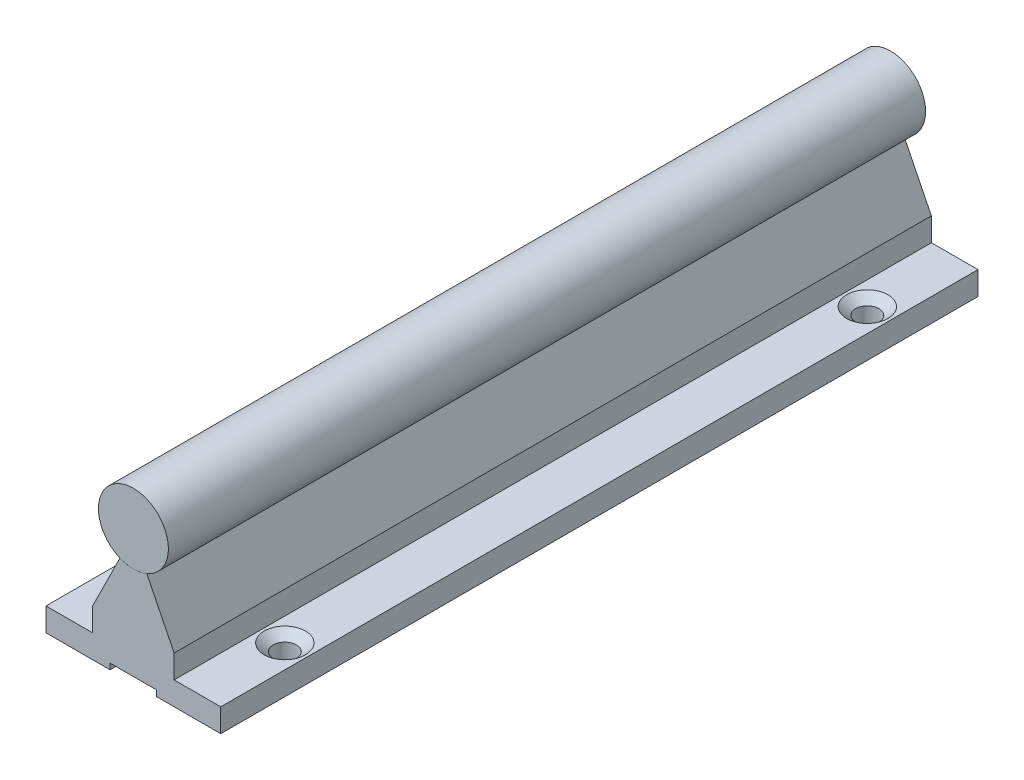
ISO-10303-21;
HEADER;
FILE_DESCRIPTION(('STEP AP214'),'2;1');
FILE_NAME('part.step','',(''),(''),'','','');
FILE_SCHEMA(('AUTOMOTIVE_DESIGN { 1 0 10303 214 1 1 1 1 }'));
ENDSEC;
DATA;
#1=APPLICATION_CONTEXT('core data for automotive mechanical design processes');
#2=APPLICATION_PROTOCOL_DEFINITION('international standard','automotive_design',2000,#1);
#3=PRODUCT_CONTEXT('',#1,'mechanical');
#4=PRODUCT('Part','Part','',(#3));
#5=PRODUCT_RELATED_PRODUCT_CATEGORY('part','',(#4));
#6=PRODUCT_DEFINITION_FORMATION('','',#4);
#7=PRODUCT_DEFINITION_CONTEXT('part definition',#1,'design');
#8=PRODUCT_DEFINITION('design','',#6,#7);
#9=PRODUCT_DEFINITION_SHAPE('','',#8);
#10=(LENGTH_UNIT() NAMED_UNIT(*) SI_UNIT(.MILLI.,.METRE.));
#11=(NAMED_UNIT(*) PLANE_ANGLE_UNIT() SI_UNIT($,.RADIAN.));
#12=(NAMED_UNIT(*) SI_UNIT($,.STERADIAN.) SOLID_ANGLE_UNIT());
#13=UNCERTAINTY_MEASURE_WITH_UNIT(LENGTH_MEASURE(1.E-05),#10,'distance_accuracy_value','');
#14=(GEOMETRIC_REPRESENTATION_CONTEXT(3) GLOBAL_UNCERTAINTY_ASSIGNED_CONTEXT((#13)) GLOBAL_UNIT_ASSIGNED_CONTEXT((#10,
#11,#12)) REPRESENTATION_CONTEXT('',''));
#15=CARTESIAN_POINT('',(0.,0.,0.));
#16=DIRECTION('',(0.,0.,1.));
#17=DIRECTION('',(1.,0.,0.));
#18=AXIS2_PLACEMENT_3D('',#15,#16,#17);
#19=CARTESIAN_POINT('',(0.,8.5,750.));
#20=DIRECTION('',(0.,0.,-1.));
#21=DIRECTION('',(-1.,0.,0.));
#22=AXIS2_PLACEMENT_3D('',#19,#20,#21);
#23=CYLINDRICAL_SURFACE('',#22,6.);
#24=CARTESIAN_POINT('',(0.,8.5,324.866250412161));
#25=DIRECTION('',(0.,0.,1.));
#26=DIRECTION('',(1.,0.,0.));
#27=AXIS2_PLACEMENT_3D('',#24,#25,#26);
#28=CIRCLE('',#27,6.);
#29=CARTESIAN_POINT('',(6.,8.5,324.866250412161));
#30=VERTEX_POINT('',#29);
#31=EDGE_CURVE('E11',#30,#30,#28,.T.);
#32=ORIENTED_EDGE('',*,*,#31,.T.);
#33=EDGE_LOOP('',(#32));
#34=FACE_BOUND('',#33,.T.);
#35=CARTESIAN_POINT('',(0.,8.5,454.866250412161));
#36=DIRECTION('',(0.,0.,-1.));
#37=DIRECTION('',(-1.,0.,0.));
#38=AXIS2_PLACEMENT_3D('',#35,#36,#37);
#39=CIRCLE('',#38,6.);
#40=CARTESIAN_POINT('',(-6.,8.5,454.866250412161));
#41=VERTEX_POINT('',#40);
#42=EDGE_CURVE('E61',#41,#41,#39,.T.);
#43=ORIENTED_EDGE('',*,*,#42,.T.);
#44=EDGE_LOOP('',(#43));
#45=FACE_BOUND('',#44,.T.);
#46=ADVANCED_FACE('F54',(#34,#45),#23,.T.);
#47=CARTESIAN_POINT('',(-15.,71.5,454.866250412161));
#48=DIRECTION('',(0.,0.,-1.));
#49=DIRECTION('',(-1.,0.,0.));
#50=AXIS2_PLACEMENT_3D('',#47,#48,#49);
#51=PLANE('',#50);
#52=ORIENTED_EDGE('',*,*,#42,.F.);
#53=EDGE_LOOP('',(#52));
#54=FACE_BOUND('',#53,.T.);
#55=ADVANCED_FACE('F67',(#54),#51,.F.);
#56=CARTESIAN_POINT('',(-15.,71.5,324.866250412161));
#57=DIRECTION('',(0.,0.,1.));
#58=DIRECTION('',(1.,0.,0.));
#59=AXIS2_PLACEMENT_3D('',#56,#57,#58);
#60=PLANE('',#59);
#61=ORIENTED_EDGE('',*,*,#31,.F.);
#62=EDGE_LOOP('',(#61));
#63=FACE_BOUND('',#62,.T.);
#64=ADVANCED_FACE('F66',(#63),#60,.F.);
#65=CLOSED_SHELL('',(#46,#55,#64));
#66=MANIFOLD_SOLID_BREP('B2',#65);
#67=CARTESIAN_POINT('',(-15.,-10.5,750.));
#68=DIRECTION('',(0.,-1.,0.));
#69=DIRECTION('',(0.,0.,-1.));
#70=AXIS2_PLACEMENT_3D('',#67,#68,#69);
#71=PLANE('',#70);
#72=CARTESIAN_POINT('',(-11.000000000001,-10.5,439.866250412161));
#73=DIRECTION('',(0.,1.,0.));
#74=DIRECTION('',(0.,0.,1.));
#75=AXIS2_PLACEMENT_3D('',#72,#73,#74);
#76=CIRCLE('',#75,3.5433);
#77=CARTESIAN_POINT('',(-11.000000000001,-10.5,443.409550412161));
#78=VERTEX_POINT('',#77);
#79=EDGE_CURVE('E264',#78,#78,#76,.T.);
#80=ORIENTED_EDGE('',*,*,#79,.F.);
#81=EDGE_LOOP('',(#80));
#82=FACE_BOUND('',#81,.T.);
#83=CARTESIAN_POINT('',(-11.0000000000014,-10.5,339.866250412161));
#84=DIRECTION('',(0.,1.,0.));
#85=DIRECTION('',(0.,0.,1.));
#86=AXIS2_PLACEMENT_3D('',#83,#84,#85);
#87=CIRCLE('',#86,3.5433);
#88=CARTESIAN_POINT('',(-11.0000000000014,-10.5,343.409550412161));
#89=VERTEX_POINT('',#88);
#90=EDGE_CURVE('E282',#89,#89,#87,.T.);
#91=ORIENTED_EDGE('',*,*,#90,.F.);
#92=EDGE_LOOP('',(#91));
#93=FACE_BOUND('',#92,.T.);
#94=DIRECTION('',(0.,0.,-1.));
#95=VECTOR('',#94,1.);
#96=CARTESIAN_POINT('',(-7.,-10.5,750.));
#97=LINE('',#96,#95);
#98=CARTESIAN_POINT('',(-7.,-10.5,454.866250412161));
#99=VERTEX_POINT('',#98);
#100=CARTESIAN_POINT('',(-7.,-10.5,324.866250412161));
#101=VERTEX_POINT('',#100);
#102=EDGE_CURVE('E227',#99,#101,#97,.T.);
#103=ORIENTED_EDGE('',*,*,#102,.T.);
#104=DIRECTION('',(-1.,0.,0.));
#105=VECTOR('',#104,1.);
#106=CARTESIAN_POINT('',(-15.,-10.5,324.866250412161));
#107=LINE('',#106,#105);
#108=CARTESIAN_POINT('',(-15.,-10.5,324.866250412161));
#109=VERTEX_POINT('',#108);
#110=EDGE_CURVE('E263',#101,#109,#107,.T.);
#111=ORIENTED_EDGE('',*,*,#110,.T.);
#112=DIRECTION('',(0.,0.,-1.));
#113=VECTOR('',#112,1.);
#114=CARTESIAN_POINT('',(-15.,-10.5,750.));
#115=LINE('',#114,#113);
#116=CARTESIAN_POINT('',(-15.,-10.5,454.866250412161));
#117=VERTEX_POINT('',#116);
#118=EDGE_CURVE('E222',#117,#109,#115,.T.);
#119=ORIENTED_EDGE('',*,*,#118,.F.);
#120=DIRECTION('',(1.,0.,0.));
#121=VECTOR('',#120,1.);
#122=CARTESIAN_POINT('',(-15.,-10.5,454.866250412161));
#123=LINE('',#122,#121);
#124=EDGE_CURVE('E357',#117,#99,#123,.T.);
#125=ORIENTED_EDGE('',*,*,#124,.T.);
#126=EDGE_LOOP('',(#103,#111,#119,#125));
#127=FACE_BOUND('',#126,.T.);
#128=ADVANCED_FACE('F99',(#82,#93,#127),#71,.F.);
#129=CARTESIAN_POINT('',(15.,-10.5,750.));
#130=DIRECTION('',(-1.,0.,0.));
#131=DIRECTION('',(0.,0.,1.));
#132=AXIS2_PLACEMENT_3D('',#129,#130,#131);
#133=PLANE('',#132);
#134=DIRECTION('',(0.,0.,-1.));
#135=VECTOR('',#134,1.);
#136=CARTESIAN_POINT('',(15.,-14.5,750.));
#137=LINE('',#136,#135);
#138=CARTESIAN_POINT('',(15.,-14.5,454.866250412161));
#139=VERTEX_POINT('',#138);
#140=CARTESIAN_POINT('',(15.,-14.5,324.866250412161));
#141=VERTEX_POINT('',#140);
#142=EDGE_CURVE('E293',#139,#141,#137,.T.);
#143=ORIENTED_EDGE('',*,*,#142,.T.);
#144=DIRECTION('',(0.,-1.,0.));
#145=VECTOR('',#144,1.);
#146=CARTESIAN_POINT('',(15.,71.5,324.866250412161));
#147=LINE('',#146,#145);
#148=CARTESIAN_POINT('',(15.,-10.5,324.866250412161));
#149=VERTEX_POINT('',#148);
#150=EDGE_CURVE('E125',#149,#141,#147,.T.);
#151=ORIENTED_EDGE('',*,*,#150,.F.);
#152=DIRECTION('',(0.,0.,-1.));
#153=VECTOR('',#152,1.);
#154=CARTESIAN_POINT('',(15.,-10.5,750.));
#155=LINE('',#154,#153);
#156=CARTESIAN_POINT('',(15.,-10.5,454.866250412161));
#157=VERTEX_POINT('',#156);
#158=EDGE_CURVE('E52',#157,#149,#155,.T.);
#159=ORIENTED_EDGE('',*,*,#158,.F.);
#160=DIRECTION('',(0.,-1.,0.));
#161=VECTOR('',#160,1.);
#162=CARTESIAN_POINT('',(15.,71.5,454.866250412161));
#163=LINE('',#162,#161);
#164=EDGE_CURVE('E371',#157,#139,#163,.T.);
#165=ORIENTED_EDGE('',*,*,#164,.T.);
#166=EDGE_LOOP('',(#143,#151,#159,#165));
#167=FACE_BOUND('',#166,.T.);
#168=ADVANCED_FACE('F105',(#167),#133,.F.);
#169=CARTESIAN_POINT('',(7.,-10.5,750.));
#170=DIRECTION('',(0.,-1.,0.));
#171=DIRECTION('',(0.,0.,-1.));
#172=AXIS2_PLACEMENT_3D('',#169,#170,#171);
#173=PLANE('',#172);
#174=CARTESIAN_POINT('',(10.999999999999,-10.5,439.866250412161));
#175=DIRECTION('',(0.,1.,0.));
#176=DIRECTION('',(0.,0.,1.));
#177=AXIS2_PLACEMENT_3D('',#174,#175,#176);
#178=CIRCLE('',#177,3.5433);
#179=CARTESIAN_POINT('',(10.999999999999,-10.5,443.409550412161));
#180=VERTEX_POINT('',#179);
#181=EDGE_CURVE('E277',#180,#180,#178,.T.);
#182=ORIENTED_EDGE('',*,*,#181,.F.);
#183=EDGE_LOOP('',(#182));
#184=FACE_BOUND('',#183,.T.);
#185=CARTESIAN_POINT('',(10.9999999999986,-10.5,339.866250412161));
#186=DIRECTION('',(0.,1.,0.));
#187=DIRECTION('',(0.,0.,1.));
#188=AXIS2_PLACEMENT_3D('',#185,#186,#187);
#189=CIRCLE('',#188,3.5433);
#190=CARTESIAN_POINT('',(10.9999999999986,-10.5,343.409550412161));
#191=VERTEX_POINT('',#190);
#192=EDGE_CURVE('E285',#191,#191,#189,.T.);
#193=ORIENTED_EDGE('',*,*,#192,.F.);
#194=EDGE_LOOP('',(#193));
#195=FACE_BOUND('',#194,.T.);
#196=ORIENTED_EDGE('',*,*,#158,.T.);
#197=DIRECTION('',(-1.,0.,0.));
#198=VECTOR('',#197,1.);
#199=CARTESIAN_POINT('',(7.,-10.5,324.866250412161));
#200=LINE('',#199,#198);
#201=CARTESIAN_POINT('',(7.,-10.5,324.866250412161));
#202=VERTEX_POINT('',#201);
#203=EDGE_CURVE('E265',#149,#202,#200,.T.);
#204=ORIENTED_EDGE('',*,*,#203,.T.);
#205=DIRECTION('',(0.,0.,-1.));
#206=VECTOR('',#205,1.);
#207=CARTESIAN_POINT('',(7.,-10.5,750.));
#208=LINE('',#207,#206);
#209=CARTESIAN_POINT('',(7.,-10.5,454.866250412161));
#210=VERTEX_POINT('',#209);
#211=EDGE_CURVE('E108',#210,#202,#208,.T.);
#212=ORIENTED_EDGE('',*,*,#211,.F.);
#213=DIRECTION('',(1.,0.,0.));
#214=VECTOR('',#213,1.);
#215=CARTESIAN_POINT('',(7.,-10.5,454.866250412161));
#216=LINE('',#215,#214);
#217=EDGE_CURVE('E257',#210,#157,#216,.T.);
#218=ORIENTED_EDGE('',*,*,#217,.T.);
#219=EDGE_LOOP('',(#196,#204,#212,#218));
#220=FACE_BOUND('',#219,.T.);
#221=ADVANCED_FACE('F259',(#184,#195,#220),#173,.F.);
#222=CARTESIAN_POINT('',(7.,-10.5,750.));
#223=DIRECTION('',(-1.,0.,0.));
#224=DIRECTION('',(0.,-1.,0.));
#225=AXIS2_PLACEMENT_3D('',#222,#223,#224);
#226=PLANE('',#225);
#227=ORIENTED_EDGE('',*,*,#211,.T.);
#228=DIRECTION('',(0.,1.,0.));
#229=VECTOR('',#228,1.);
#230=CARTESIAN_POINT('',(7.,-10.5,324.866250412161));
#231=LINE('',#230,#229);
#232=CARTESIAN_POINT('',(7.,-6.5,324.866250412161));
#233=VERTEX_POINT('',#232);
#234=EDGE_CURVE('E255',#202,#233,#231,.T.);
#235=ORIENTED_EDGE('',*,*,#234,.T.);
#236=DIRECTION('',(0.,0.,-1.));
#237=VECTOR('',#236,1.);
#238=CARTESIAN_POINT('',(7.,-6.5,750.));
#239=LINE('',#238,#237);
#240=CARTESIAN_POINT('',(7.,-6.5,454.866250412161));
#241=VERTEX_POINT('',#240);
#242=EDGE_CURVE('E243',#241,#233,#239,.T.);
#243=ORIENTED_EDGE('',*,*,#242,.F.);
#244=DIRECTION('',(0.,-1.,0.));
#245=VECTOR('',#244,1.);
#246=CARTESIAN_POINT('',(7.,-10.5,454.866250412161));
#247=LINE('',#246,#245);
#248=EDGE_CURVE('E254',#241,#210,#247,.T.);
#249=ORIENTED_EDGE('',*,*,#248,.T.);
#250=EDGE_LOOP('',(#227,#235,#243,#249));
#251=FACE_BOUND('',#250,.T.);
#252=ADVANCED_FACE('F252',(#251),#226,.F.);
#253=CARTESIAN_POINT('',(7.,-6.5,750.));
#254=DIRECTION('',(-0.895711760239414,-0.444635179184926,0.));
#255=DIRECTION('',(0.444635179184926,-0.895711760239414,0.));
#256=AXIS2_PLACEMENT_3D('',#253,#254,#255);
#257=PLANE('',#256);
#258=ORIENTED_EDGE('',*,*,#242,.T.);
#259=DIRECTION('',(-0.444635179184926,0.895711760239414,0.));
#260=VECTOR('',#259,1.);
#261=CARTESIAN_POINT('',(7.,-6.5,324.866250412161));
#262=LINE('',#261,#260);
#263=CARTESIAN_POINT('',(2.30401201977684,2.9600064428987,324.866250412161));
#264=VERTEX_POINT('',#263);
#265=EDGE_CURVE('E270',#233,#264,#262,.T.);
#266=ORIENTED_EDGE('',*,*,#265,.T.);
#267=DIRECTION('',(0.,0.,-1.));
#268=VECTOR('',#267,1.);
#269=CARTESIAN_POINT('',(2.30401201977684,2.9600064428987,750.));
#270=LINE('',#269,#268);
#271=CARTESIAN_POINT('',(2.30401201977684,2.9600064428987,454.866250412161));
#272=VERTEX_POINT('',#271);
#273=EDGE_CURVE('E241',#272,#264,#270,.T.);
#274=ORIENTED_EDGE('',*,*,#273,.F.);
#275=DIRECTION('',(0.444635179184926,-0.895711760239414,0.));
#276=VECTOR('',#275,1.);
#277=CARTESIAN_POINT('',(7.,-6.5,454.866250412161));
#278=LINE('',#277,#276);
#279=EDGE_CURVE('E346',#272,#241,#278,.T.);
#280=ORIENTED_EDGE('',*,*,#279,.T.);
#281=EDGE_LOOP('',(#258,#266,#274,#280));
#282=FACE_BOUND('',#281,.T.);
#283=ADVANCED_FACE('F340',(#282),#257,.F.);
#284=CARTESIAN_POINT('',(0.,8.5,750.));
#285=DIRECTION('',(0.,0.,-1.));
#286=DIRECTION('',(-1.,0.,0.));
#287=AXIS2_PLACEMENT_3D('',#284,#285,#286);
#288=CYLINDRICAL_SURFACE('',#287,6.);
#289=ORIENTED_EDGE('',*,*,#273,.T.);
#290=CARTESIAN_POINT('',(0.,8.5,324.866250412161));
#291=DIRECTION('',(0.,0.,1.));
#292=DIRECTION('',(1.,0.,0.));
#293=AXIS2_PLACEMENT_3D('',#290,#291,#292);
#294=CIRCLE('',#293,6.);
#295=CARTESIAN_POINT('',(-2.30401201977684,2.96000644289871,324.866250412161));
#296=VERTEX_POINT('',#295);
#297=EDGE_CURVE('E333',#264,#296,#294,.F.);
#298=ORIENTED_EDGE('',*,*,#297,.T.);
#299=DIRECTION('',(0.,0.,-1.));
#300=VECTOR('',#299,1.);
#301=CARTESIAN_POINT('',(-2.30401201977684,2.96000644289871,750.));
#302=LINE('',#301,#300);
#303=CARTESIAN_POINT('',(-2.30401201977684,2.96000644289871,454.866250412161));
#304=VERTEX_POINT('',#303);
#305=EDGE_CURVE('E236',#304,#296,#302,.T.);
#306=ORIENTED_EDGE('',*,*,#305,.F.);
#307=CARTESIAN_POINT('',(0.,8.5,454.866250412161));
#308=DIRECTION('',(0.,0.,-1.));
#309=DIRECTION('',(-1.,0.,0.));
#310=AXIS2_PLACEMENT_3D('',#307,#308,#309);
#311=CIRCLE('',#310,6.);
#312=EDGE_CURVE('E347',#304,#272,#311,.F.);
#313=ORIENTED_EDGE('',*,*,#312,.T.);
#314=EDGE_LOOP('',(#289,#298,#306,#313));
#315=FACE_BOUND('',#314,.T.);
#316=ADVANCED_FACE('F345',(#315),#288,.F.);
#317=CARTESIAN_POINT('',(-7.,-6.5,750.));
#318=DIRECTION('',(0.895711760239414,-0.444635179184926,0.));
#319=DIRECTION('',(0.444635179184926,0.895711760239414,0.));
#320=AXIS2_PLACEMENT_3D('',#317,#318,#319);
#321=PLANE('',#320);
#322=ORIENTED_EDGE('',*,*,#305,.T.);
#323=DIRECTION('',(-0.444635179184926,-0.895711760239414,0.));
#324=VECTOR('',#323,1.);
#325=CARTESIAN_POINT('',(-7.,-6.5,324.866250412161));
#326=LINE('',#325,#324);
#327=CARTESIAN_POINT('',(-7.,-6.5,324.866250412161));
#328=VERTEX_POINT('',#327);
#329=EDGE_CURVE('E330',#296,#328,#326,.T.);
#330=ORIENTED_EDGE('',*,*,#329,.T.);
#331=DIRECTION('',(0.,0.,-1.));
#332=VECTOR('',#331,1.);
#333=CARTESIAN_POINT('',(-7.,-6.5,750.));
#334=LINE('',#333,#332);
#335=CARTESIAN_POINT('',(-7.,-6.5,454.866250412161));
#336=VERTEX_POINT('',#335);
#337=EDGE_CURVE('E231',#336,#328,#334,.T.);
#338=ORIENTED_EDGE('',*,*,#337,.F.);
#339=DIRECTION('',(0.444635179184926,0.895711760239414,0.));
#340=VECTOR('',#339,1.);
#341=CARTESIAN_POINT('',(-7.,-6.5,454.866250412161));
#342=LINE('',#341,#340);
#343=EDGE_CURVE('E349',#336,#304,#342,.T.);
#344=ORIENTED_EDGE('',*,*,#343,.T.);
#345=EDGE_LOOP('',(#322,#330,#338,#344));
#346=FACE_BOUND('',#345,.T.);
#347=ADVANCED_FACE('F382',(#346),#321,.F.);
#348=CARTESIAN_POINT('',(-7.,-10.5,750.));
#349=DIRECTION('',(1.,0.,0.));
#350=DIRECTION('',(0.,1.,0.));
#351=AXIS2_PLACEMENT_3D('',#348,#349,#350);
#352=PLANE('',#351);
#353=ORIENTED_EDGE('',*,*,#337,.T.);
#354=DIRECTION('',(0.,-1.,0.));
#355=VECTOR('',#354,1.);
#356=CARTESIAN_POINT('',(-7.,-10.5,324.866250412161));
#357=LINE('',#356,#355);
#358=EDGE_CURVE('E322',#328,#101,#357,.T.);
#359=ORIENTED_EDGE('',*,*,#358,.T.);
#360=ORIENTED_EDGE('',*,*,#102,.F.);
#361=DIRECTION('',(0.,1.,0.));
#362=VECTOR('',#361,1.);
#363=CARTESIAN_POINT('',(-7.,-10.5,454.866250412161));
#364=LINE('',#363,#362);
#365=EDGE_CURVE('E352',#99,#336,#364,.T.);
#366=ORIENTED_EDGE('',*,*,#365,.T.);
#367=EDGE_LOOP('',(#353,#359,#360,#366));
#368=FACE_BOUND('',#367,.T.);
#369=ADVANCED_FACE('F381',(#368),#352,.F.);
#370=CARTESIAN_POINT('',(-15.,-10.5,750.));
#371=DIRECTION('',(1.,0.,0.));
#372=DIRECTION('',(0.,0.,-1.));
#373=AXIS2_PLACEMENT_3D('',#370,#371,#372);
#374=PLANE('',#373);
#375=ORIENTED_EDGE('',*,*,#118,.T.);
#376=DIRECTION('',(0.,-1.,0.));
#377=VECTOR('',#376,1.);
#378=CARTESIAN_POINT('',(-15.,71.5,324.866250412161));
#379=LINE('',#378,#377);
#380=CARTESIAN_POINT('',(-15.,-14.5,324.866250412161));
#381=VERTEX_POINT('',#380);
#382=EDGE_CURVE('E201',#109,#381,#379,.T.);
#383=ORIENTED_EDGE('',*,*,#382,.T.);
#384=DIRECTION('',(0.,0.,-1.));
#385=VECTOR('',#384,1.);
#386=CARTESIAN_POINT('',(-15.,-14.5,750.));
#387=LINE('',#386,#385);
#388=CARTESIAN_POINT('',(-15.,-14.5,454.866250412161));
#389=VERTEX_POINT('',#388);
#390=EDGE_CURVE('E218',#389,#381,#387,.T.);
#391=ORIENTED_EDGE('',*,*,#390,.F.);
#392=DIRECTION('',(0.,-1.,0.));
#393=VECTOR('',#392,1.);
#394=CARTESIAN_POINT('',(-15.,71.5,454.866250412161));
#395=LINE('',#394,#393);
#396=EDGE_CURVE('E369',#117,#389,#395,.T.);
#397=ORIENTED_EDGE('',*,*,#396,.F.);
#398=EDGE_LOOP('',(#375,#383,#391,#397));
#399=FACE_BOUND('',#398,.T.);
#400=ADVANCED_FACE('F220',(#399),#374,.F.);
#401=CARTESIAN_POINT('',(-7.,-14.5,750.));
#402=DIRECTION('',(0.,1.,0.));
#403=DIRECTION('',(0.,0.,1.));
#404=AXIS2_PLACEMENT_3D('',#401,#402,#403);
#405=PLANE('',#404);
#406=CARTESIAN_POINT('',(-11.0000000000014,-14.5,339.866250412161));
#407=DIRECTION('',(0.,1.,0.));
#408=DIRECTION('',(0.,0.,1.));
#409=AXIS2_PLACEMENT_3D('',#406,#407,#408);
#410=CIRCLE('',#409,2.);
#411=CARTESIAN_POINT('',(-11.0000000000014,-14.5,341.866250412161));
#412=VERTEX_POINT('',#411);
#413=EDGE_CURVE('E296',#412,#412,#410,.T.);
#414=ORIENTED_EDGE('',*,*,#413,.T.);
#415=EDGE_LOOP('',(#414));
#416=FACE_BOUND('',#415,.T.);
#417=CARTESIAN_POINT('',(-11.000000000001,-14.5,439.866250412161));
#418=DIRECTION('',(0.,1.,0.));
#419=DIRECTION('',(0.,0.,1.));
#420=AXIS2_PLACEMENT_3D('',#417,#418,#419);
#421=CIRCLE('',#420,2.);
#422=CARTESIAN_POINT('',(-11.000000000001,-14.5,441.866250412161));
#423=VERTEX_POINT('',#422);
#424=EDGE_CURVE('E295',#423,#423,#421,.T.);
#425=ORIENTED_EDGE('',*,*,#424,.T.);
#426=EDGE_LOOP('',(#425));
#427=FACE_BOUND('',#426,.T.);
#428=ORIENTED_EDGE('',*,*,#390,.T.);
#429=DIRECTION('',(-1.,0.,0.));
#430=VECTOR('',#429,1.);
#431=CARTESIAN_POINT('',(-15.,-14.5,324.866250412161));
#432=LINE('',#431,#430);
#433=CARTESIAN_POINT('',(-4.,-14.5,324.866250412161));
#434=VERTEX_POINT('',#433);
#435=EDGE_CURVE('E199',#434,#381,#432,.T.);
#436=ORIENTED_EDGE('',*,*,#435,.F.);
#437=DIRECTION('',(0.,0.,-1.));
#438=VECTOR('',#437,1.);
#439=CARTESIAN_POINT('',(-4.,-14.5,750.));
#440=LINE('',#439,#438);
#441=CARTESIAN_POINT('',(-4.,-14.5,454.866250412161));
#442=VERTEX_POINT('',#441);
#443=EDGE_CURVE('E223',#442,#434,#440,.T.);
#444=ORIENTED_EDGE('',*,*,#443,.F.);
#445=DIRECTION('',(1.,0.,0.));
#446=VECTOR('',#445,1.);
#447=CARTESIAN_POINT('',(-15.,-14.5,454.866250412161));
#448=LINE('',#447,#446);
#449=EDGE_CURVE('E215',#389,#442,#448,.T.);
#450=ORIENTED_EDGE('',*,*,#449,.F.);
#451=EDGE_LOOP('',(#428,#436,#444,#450));
#452=FACE_BOUND('',#451,.T.);
#453=ADVANCED_FACE('F221',(#416,#427,#452),#405,.F.);
#454=CARTESIAN_POINT('',(-4.,-14.5,750.));
#455=DIRECTION('',(-1.,0.,0.));
#456=DIRECTION('',(0.,0.,1.));
#457=AXIS2_PLACEMENT_3D('',#454,#455,#456);
#458=PLANE('',#457);
#459=ORIENTED_EDGE('',*,*,#443,.T.);
#460=DIRECTION('',(0.,1.,0.));
#461=VECTOR('',#460,1.);
#462=CARTESIAN_POINT('',(-4.,-14.5,324.866250412161));
#463=LINE('',#462,#461);
#464=CARTESIAN_POINT('',(-4.,-13.5,324.866250412161));
#465=VERTEX_POINT('',#464);
#466=EDGE_CURVE('E206',#434,#465,#463,.T.);
#467=ORIENTED_EDGE('',*,*,#466,.T.);
#468=DIRECTION('',(0.,0.,-1.));
#469=VECTOR('',#468,1.);
#470=CARTESIAN_POINT('',(-4.,-13.5,750.));
#471=LINE('',#470,#469);
#472=CARTESIAN_POINT('',(-4.,-13.5,454.866250412161));
#473=VERTEX_POINT('',#472);
#474=EDGE_CURVE('E228',#473,#465,#471,.T.);
#475=ORIENTED_EDGE('',*,*,#474,.F.);
#476=DIRECTION('',(0.,-1.,0.));
#477=VECTOR('',#476,1.);
#478=CARTESIAN_POINT('',(-4.,-14.5,454.866250412161));
#479=LINE('',#478,#477);
#480=EDGE_CURVE('E323',#473,#442,#479,.T.);
#481=ORIENTED_EDGE('',*,*,#480,.T.);
#482=EDGE_LOOP('',(#459,#467,#475,#481));
#483=FACE_BOUND('',#482,.T.);
#484=ADVANCED_FACE('F325',(#483),#458,.F.);
#485=CARTESIAN_POINT('',(-4.,-13.5,750.));
#486=DIRECTION('',(0.,1.,0.));
#487=DIRECTION('',(0.,0.,1.));
#488=AXIS2_PLACEMENT_3D('',#485,#486,#487);
#489=PLANE('',#488);
#490=ORIENTED_EDGE('',*,*,#474,.T.);
#491=DIRECTION('',(1.,0.,0.));
#492=VECTOR('',#491,1.);
#493=CARTESIAN_POINT('',(-4.,-13.5,324.866250412161));
#494=LINE('',#493,#492);
#495=CARTESIAN_POINT('',(4.,-13.5,324.866250412161));
#496=VERTEX_POINT('',#495);
#497=EDGE_CURVE('E318',#465,#496,#494,.T.);
#498=ORIENTED_EDGE('',*,*,#497,.T.);
#499=DIRECTION('',(0.,0.,-1.));
#500=VECTOR('',#499,1.);
#501=CARTESIAN_POINT('',(4.,-13.5,750.));
#502=LINE('',#501,#500);
#503=CARTESIAN_POINT('',(4.,-13.5,454.866250412161));
#504=VERTEX_POINT('',#503);
#505=EDGE_CURVE('E310',#504,#496,#502,.T.);
#506=ORIENTED_EDGE('',*,*,#505,.F.);
#507=DIRECTION('',(-1.,0.,0.));
#508=VECTOR('',#507,1.);
#509=CARTESIAN_POINT('',(-4.,-13.5,454.866250412161));
#510=LINE('',#509,#508);
#511=EDGE_CURVE('E317',#504,#473,#510,.T.);
#512=ORIENTED_EDGE('',*,*,#511,.T.);
#513=EDGE_LOOP('',(#490,#498,#506,#512));
#514=FACE_BOUND('',#513,.T.);
#515=ADVANCED_FACE('F316',(#514),#489,.F.);
#516=CARTESIAN_POINT('',(4.,-14.5,750.));
#517=DIRECTION('',(1.,0.,0.));
#518=DIRECTION('',(0.,1.,0.));
#519=AXIS2_PLACEMENT_3D('',#516,#517,#518);
#520=PLANE('',#519);
#521=ORIENTED_EDGE('',*,*,#505,.T.);
#522=DIRECTION('',(0.,-1.,0.));
#523=VECTOR('',#522,1.);
#524=CARTESIAN_POINT('',(4.,-14.5,324.866250412161));
#525=LINE('',#524,#523);
#526=CARTESIAN_POINT('',(4.,-14.5,324.866250412161));
#527=VERTEX_POINT('',#526);
#528=EDGE_CURVE('E328',#496,#527,#525,.T.);
#529=ORIENTED_EDGE('',*,*,#528,.T.);
#530=DIRECTION('',(0.,0.,-1.));
#531=VECTOR('',#530,1.);
#532=CARTESIAN_POINT('',(4.,-14.5,750.));
#533=LINE('',#532,#531);
#534=CARTESIAN_POINT('',(4.,-14.5,454.866250412161));
#535=VERTEX_POINT('',#534);
#536=EDGE_CURVE('E308',#535,#527,#533,.T.);
#537=ORIENTED_EDGE('',*,*,#536,.F.);
#538=DIRECTION('',(0.,1.,0.));
#539=VECTOR('',#538,1.);
#540=CARTESIAN_POINT('',(4.,-14.5,454.866250412161));
#541=LINE('',#540,#539);
#542=EDGE_CURVE('E116',#535,#504,#541,.T.);
#543=ORIENTED_EDGE('',*,*,#542,.T.);
#544=EDGE_LOOP('',(#521,#529,#537,#543));
#545=FACE_BOUND('',#544,.T.);
#546=ADVANCED_FACE('F361',(#545),#520,.F.);
#547=CARTESIAN_POINT('',(7.,-14.5,750.));
#548=DIRECTION('',(0.,1.,0.));
#549=DIRECTION('',(0.,0.,1.));
#550=AXIS2_PLACEMENT_3D('',#547,#548,#549);
#551=PLANE('',#550);
#552=CARTESIAN_POINT('',(10.9999999999986,-14.5,339.866250412161));
#553=DIRECTION('',(0.,1.,0.));
#554=DIRECTION('',(0.,0.,1.));
#555=AXIS2_PLACEMENT_3D('',#552,#553,#554);
#556=CIRCLE('',#555,2.);
#557=CARTESIAN_POINT('',(10.9999999999986,-14.5,341.866250412161));
#558=VERTEX_POINT('',#557);
#559=EDGE_CURVE('E292',#558,#558,#556,.T.);
#560=ORIENTED_EDGE('',*,*,#559,.T.);
#561=EDGE_LOOP('',(#560));
#562=FACE_BOUND('',#561,.T.);
#563=CARTESIAN_POINT('',(10.999999999999,-14.5,439.866250412161));
#564=DIRECTION('',(0.,1.,0.));
#565=DIRECTION('',(0.,0.,1.));
#566=AXIS2_PLACEMENT_3D('',#563,#564,#565);
#567=CIRCLE('',#566,2.);
#568=CARTESIAN_POINT('',(10.999999999999,-14.5,441.866250412161));
#569=VERTEX_POINT('',#568);
#570=EDGE_CURVE('E298',#569,#569,#567,.T.);
#571=ORIENTED_EDGE('',*,*,#570,.T.);
#572=EDGE_LOOP('',(#571));
#573=FACE_BOUND('',#572,.T.);
#574=ORIENTED_EDGE('',*,*,#536,.T.);
#575=EDGE_CURVE('E211',#141,#527,#432,.T.);
#576=ORIENTED_EDGE('',*,*,#575,.F.);
#577=ORIENTED_EDGE('',*,*,#142,.F.);
#578=EDGE_CURVE('E370',#535,#139,#448,.T.);
#579=ORIENTED_EDGE('',*,*,#578,.F.);
#580=EDGE_LOOP('',(#574,#576,#577,#579));
#581=FACE_BOUND('',#580,.T.);
#582=ADVANCED_FACE('F364',(#562,#573,#581),#551,.F.);
#583=CARTESIAN_POINT('',(10.999999999999,-14.5,439.866250412161));
#584=DIRECTION('',(0.,1.,0.));
#585=DIRECTION('',(0.,0.,1.));
#586=AXIS2_PLACEMENT_3D('',#583,#584,#585);
#587=CYLINDRICAL_SURFACE('',#586,2.);
#588=CARTESIAN_POINT('',(10.999999999999,-11.7949824607959,439.866250412161));
#589=DIRECTION('',(0.,1.,0.));
#590=DIRECTION('',(0.,0.,1.));
#591=AXIS2_PLACEMENT_3D('',#588,#589,#590);
#592=CIRCLE('',#591,2.);
#593=CARTESIAN_POINT('',(10.999999999999,-11.7949824607959,441.866250412161));
#594=VERTEX_POINT('',#593);
#595=EDGE_CURVE('E276',#594,#594,#592,.T.);
#596=ORIENTED_EDGE('',*,*,#595,.T.);
#597=EDGE_LOOP('',(#596));
#598=FACE_BOUND('',#597,.T.);
#599=ORIENTED_EDGE('',*,*,#570,.F.);
#600=EDGE_LOOP('',(#599));
#601=FACE_BOUND('',#600,.T.);
#602=ADVANCED_FACE('F438',(#598,#601),#587,.F.);
#603=CARTESIAN_POINT('',(10.9999999999986,-14.5,339.866250412161));
#604=DIRECTION('',(0.,1.,0.));
#605=DIRECTION('',(0.,0.,1.));
#606=AXIS2_PLACEMENT_3D('',#603,#604,#605);
#607=CYLINDRICAL_SURFACE('',#606,2.);
#608=CARTESIAN_POINT('',(10.9999999999986,-11.7949824607959,339.866250412161));
#609=DIRECTION('',(0.,1.,0.));
#610=DIRECTION('',(0.,0.,1.));
#611=AXIS2_PLACEMENT_3D('',#608,#609,#610);
#612=CIRCLE('',#611,2.);
#613=CARTESIAN_POINT('',(10.9999999999986,-11.7949824607959,341.866250412161));
#614=VERTEX_POINT('',#613);
#615=EDGE_CURVE('E287',#614,#614,#612,.T.);
#616=ORIENTED_EDGE('',*,*,#615,.T.);
#617=EDGE_LOOP('',(#616));
#618=FACE_BOUND('',#617,.T.);
#619=ORIENTED_EDGE('',*,*,#559,.F.);
#620=EDGE_LOOP('',(#619));
#621=FACE_BOUND('',#620,.T.);
#622=ADVANCED_FACE('F434',(#618,#621),#607,.F.);
#623=CARTESIAN_POINT('',(-11.000000000001,-14.5,439.866250412161));
#624=DIRECTION('',(0.,1.,0.));
#625=DIRECTION('',(0.,0.,1.));
#626=AXIS2_PLACEMENT_3D('',#623,#624,#625);
#627=CYLINDRICAL_SURFACE('',#626,2.);
#628=CARTESIAN_POINT('',(-11.000000000001,-11.7949824607959,439.866250412161));
#629=DIRECTION('',(0.,1.,0.));
#630=DIRECTION('',(0.,0.,1.));
#631=AXIS2_PLACEMENT_3D('',#628,#629,#630);
#632=CIRCLE('',#631,2.);
#633=CARTESIAN_POINT('',(-11.000000000001,-11.7949824607959,441.866250412161));
#634=VERTEX_POINT('',#633);
#635=EDGE_CURVE('E272',#634,#634,#632,.T.);
#636=ORIENTED_EDGE('',*,*,#635,.T.);
#637=EDGE_LOOP('',(#636));
#638=FACE_BOUND('',#637,.T.);
#639=ORIENTED_EDGE('',*,*,#424,.F.);
#640=EDGE_LOOP('',(#639));
#641=FACE_BOUND('',#640,.T.);
#642=ADVANCED_FACE('F437',(#638,#641),#627,.F.);
#643=CARTESIAN_POINT('',(-11.0000000000014,-14.5,339.866250412161));
#644=DIRECTION('',(0.,1.,0.));
#645=DIRECTION('',(0.,0.,1.));
#646=AXIS2_PLACEMENT_3D('',#643,#644,#645);
#647=CYLINDRICAL_SURFACE('',#646,2.);
#648=CARTESIAN_POINT('',(-11.0000000000014,-11.7949824607959,339.866250412161));
#649=DIRECTION('',(0.,1.,0.));
#650=DIRECTION('',(0.,0.,1.));
#651=AXIS2_PLACEMENT_3D('',#648,#649,#650);
#652=CIRCLE('',#651,2.);
#653=CARTESIAN_POINT('',(-11.0000000000014,-11.7949824607959,341.866250412161));
#654=VERTEX_POINT('',#653);
#655=EDGE_CURVE('E102',#654,#654,#652,.T.);
#656=ORIENTED_EDGE('',*,*,#655,.T.);
#657=EDGE_LOOP('',(#656));
#658=FACE_BOUND('',#657,.T.);
#659=ORIENTED_EDGE('',*,*,#413,.F.);
#660=EDGE_LOOP('',(#659));
#661=FACE_BOUND('',#660,.T.);
#662=ADVANCED_FACE('F431',(#658,#661),#647,.F.);
#663=CARTESIAN_POINT('',(10.9999999999986,-10.5,339.866250412161));
#664=DIRECTION('',(0.,1.,0.));
#665=DIRECTION('',(0.,0.,1.));
#666=AXIS2_PLACEMENT_3D('',#663,#664,#665);
#667=CONICAL_SURFACE('',#666,3.5433,0.872664625997165);
#668=ORIENTED_EDGE('',*,*,#192,.T.);
#669=EDGE_LOOP('',(#668));
#670=FACE_BOUND('',#669,.T.);
#671=ORIENTED_EDGE('',*,*,#615,.F.);
#672=EDGE_LOOP('',(#671));
#673=FACE_BOUND('',#672,.T.);
#674=ADVANCED_FACE('F430',(#670,#673),#667,.F.);
#675=CARTESIAN_POINT('',(-11.0000000000014,-10.5,339.866250412161));
#676=DIRECTION('',(0.,1.,0.));
#677=DIRECTION('',(0.,0.,1.));
#678=AXIS2_PLACEMENT_3D('',#675,#676,#677);
#679=CONICAL_SURFACE('',#678,3.5433,0.872664625997165);
#680=ORIENTED_EDGE('',*,*,#90,.T.);
#681=EDGE_LOOP('',(#680));
#682=FACE_BOUND('',#681,.T.);
#683=ORIENTED_EDGE('',*,*,#655,.F.);
#684=EDGE_LOOP('',(#683));
#685=FACE_BOUND('',#684,.T.);
#686=ADVANCED_FACE('F429',(#682,#685),#679,.F.);
#687=CARTESIAN_POINT('',(10.999999999999,-10.5,439.866250412161));
#688=DIRECTION('',(0.,1.,0.));
#689=DIRECTION('',(0.,0.,1.));
#690=AXIS2_PLACEMENT_3D('',#687,#688,#689);
#691=CONICAL_SURFACE('',#690,3.5433,0.872664625997165);
#692=ORIENTED_EDGE('',*,*,#181,.T.);
#693=EDGE_LOOP('',(#692));
#694=FACE_BOUND('',#693,.T.);
#695=ORIENTED_EDGE('',*,*,#595,.F.);
#696=EDGE_LOOP('',(#695));
#697=FACE_BOUND('',#696,.T.);
#698=ADVANCED_FACE('F395',(#694,#697),#691,.F.);
#699=CARTESIAN_POINT('',(-11.000000000001,-10.5,439.866250412161));
#700=DIRECTION('',(0.,1.,0.));
#701=DIRECTION('',(0.,0.,1.));
#702=AXIS2_PLACEMENT_3D('',#699,#700,#701);
#703=CONICAL_SURFACE('',#702,3.5433,0.872664625997165);
#704=ORIENTED_EDGE('',*,*,#79,.T.);
#705=EDGE_LOOP('',(#704));
#706=FACE_BOUND('',#705,.T.);
#707=ORIENTED_EDGE('',*,*,#635,.F.);
#708=EDGE_LOOP('',(#707));
#709=FACE_BOUND('',#708,.T.);
#710=ADVANCED_FACE('F390',(#706,#709),#703,.F.);
#711=CARTESIAN_POINT('',(-15.,71.5,454.866250412161));
#712=DIRECTION('',(0.,0.,-1.));
#713=DIRECTION('',(-1.,0.,0.));
#714=AXIS2_PLACEMENT_3D('',#711,#712,#713);
#715=PLANE('',#714);
#716=ORIENTED_EDGE('',*,*,#396,.T.);
#717=ORIENTED_EDGE('',*,*,#449,.T.);
#718=ORIENTED_EDGE('',*,*,#480,.F.);
#719=ORIENTED_EDGE('',*,*,#511,.F.);
#720=ORIENTED_EDGE('',*,*,#542,.F.);
#721=ORIENTED_EDGE('',*,*,#578,.T.);
#722=ORIENTED_EDGE('',*,*,#164,.F.);
#723=ORIENTED_EDGE('',*,*,#217,.F.);
#724=ORIENTED_EDGE('',*,*,#248,.F.);
#725=ORIENTED_EDGE('',*,*,#279,.F.);
#726=ORIENTED_EDGE('',*,*,#312,.F.);
#727=ORIENTED_EDGE('',*,*,#343,.F.);
#728=ORIENTED_EDGE('',*,*,#365,.F.);
#729=ORIENTED_EDGE('',*,*,#124,.F.);
#730=EDGE_LOOP('',(#716,#717,#718,#719,#720,#721,#722,#723,#724,#725,#726,#727,#728,#729));
#731=FACE_BOUND('',#730,.T.);
#732=ADVANCED_FACE('F384',(#731),#715,.F.);
#733=CARTESIAN_POINT('',(-15.,71.5,324.866250412161));
#734=DIRECTION('',(0.,0.,1.));
#735=DIRECTION('',(1.,0.,0.));
#736=AXIS2_PLACEMENT_3D('',#733,#734,#735);
#737=PLANE('',#736);
#738=ORIENTED_EDGE('',*,*,#358,.F.);
#739=ORIENTED_EDGE('',*,*,#329,.F.);
#740=ORIENTED_EDGE('',*,*,#297,.F.);
#741=ORIENTED_EDGE('',*,*,#265,.F.);
#742=ORIENTED_EDGE('',*,*,#234,.F.);
#743=ORIENTED_EDGE('',*,*,#203,.F.);
#744=ORIENTED_EDGE('',*,*,#150,.T.);
#745=ORIENTED_EDGE('',*,*,#575,.T.);
#746=ORIENTED_EDGE('',*,*,#528,.F.);
#747=ORIENTED_EDGE('',*,*,#497,.F.);
#748=ORIENTED_EDGE('',*,*,#466,.F.);
#749=ORIENTED_EDGE('',*,*,#435,.T.);
#750=ORIENTED_EDGE('',*,*,#382,.F.);
#751=ORIENTED_EDGE('',*,*,#110,.F.);
#752=EDGE_LOOP('',(#738,#739,#740,#741,#742,#743,#744,#745,#746,#747,#748,#749,#750,#751));
#753=FACE_BOUND('',#752,.T.);
#754=ADVANCED_FACE('F205',(#753),#737,.F.);
#755=CLOSED_SHELL('',(#128,#168,#221,#252,#283,#316,#347,#369,#400,#453,#484,#515,#546,#582,
#602,#622,#642,#662,#674,#686,#698,#710,#732,#754));
#756=MANIFOLD_SOLID_BREP('B6',#755);
#757=ADVANCED_BREP_SHAPE_REPRESENTATION('',(#18,#66,#756),#14);
#758=SHAPE_DEFINITION_REPRESENTATION(#9,#757);
ENDSEC;
END-ISO-10303-21;
